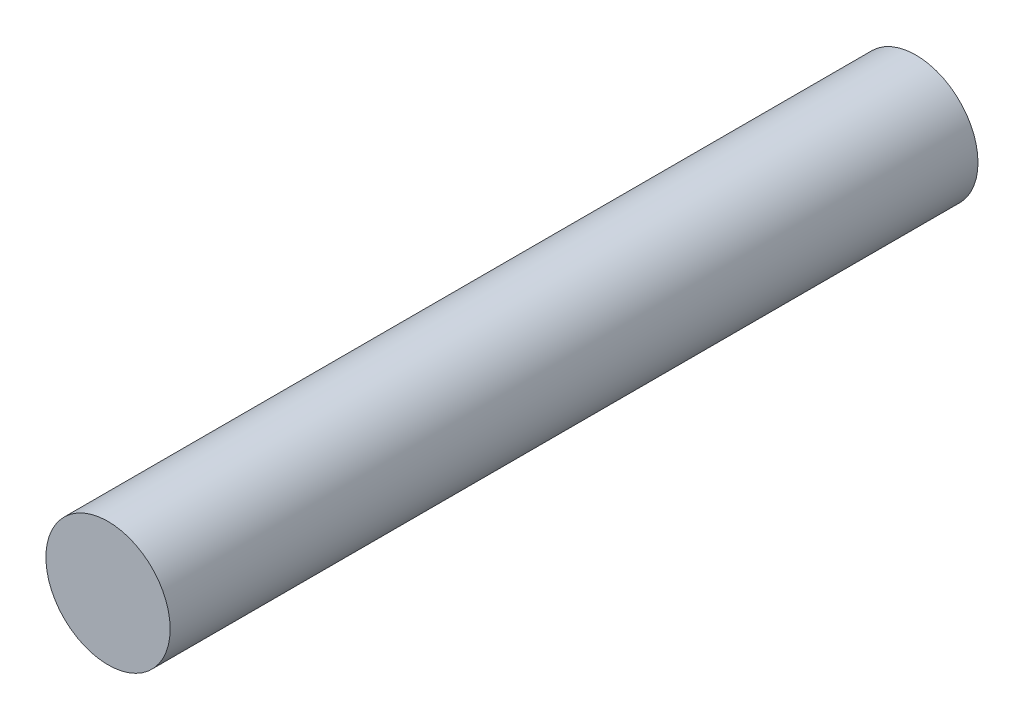
ISO-10303-21;
HEADER;
FILE_DESCRIPTION(('STEP AP214'),'2;1');
FILE_NAME('part.step','',(''),(''),'','','');
FILE_SCHEMA(('AUTOMOTIVE_DESIGN { 1 0 10303 214 1 1 1 1 }'));
ENDSEC;
DATA;
#1=APPLICATION_CONTEXT('core data for automotive mechanical design processes');
#2=APPLICATION_PROTOCOL_DEFINITION('international standard','automotive_design',2000,#1);
#3=PRODUCT_CONTEXT('',#1,'mechanical');
#4=PRODUCT('Part','Part','',(#3));
#5=PRODUCT_RELATED_PRODUCT_CATEGORY('part','',(#4));
#6=PRODUCT_DEFINITION_FORMATION('','',#4);
#7=PRODUCT_DEFINITION_CONTEXT('part definition',#1,'design');
#8=PRODUCT_DEFINITION('design','',#6,#7);
#9=PRODUCT_DEFINITION_SHAPE('','',#8);
#10=(LENGTH_UNIT() NAMED_UNIT(*) SI_UNIT(.MILLI.,.METRE.));
#11=(NAMED_UNIT(*) PLANE_ANGLE_UNIT() SI_UNIT($,.RADIAN.));
#12=(NAMED_UNIT(*) SI_UNIT($,.STERADIAN.) SOLID_ANGLE_UNIT());
#13=UNCERTAINTY_MEASURE_WITH_UNIT(LENGTH_MEASURE(1.E-05),#10,'distance_accuracy_value','');
#14=(GEOMETRIC_REPRESENTATION_CONTEXT(3) GLOBAL_UNCERTAINTY_ASSIGNED_CONTEXT((#13)) GLOBAL_UNIT_ASSIGNED_CONTEXT((#10,
#11,#12)) REPRESENTATION_CONTEXT('',''));
#15=CARTESIAN_POINT('',(0.,0.,0.));
#16=DIRECTION('',(0.,0.,1.));
#17=DIRECTION('',(1.,0.,0.));
#18=AXIS2_PLACEMENT_3D('',#15,#16,#17);
#19=CARTESIAN_POINT('',(0.,0.,41.275));
#20=DIRECTION('',(0.,0.,-1.));
#21=DIRECTION('',(-1.,0.,0.));
#22=AXIS2_PLACEMENT_3D('',#19,#20,#21);
#23=CYLINDRICAL_SURFACE('',#22,3.175);
#24=CARTESIAN_POINT('',(0.,0.,41.275));
#25=DIRECTION('',(0.,0.,1.));
#26=DIRECTION('',(1.,0.,0.));
#27=AXIS2_PLACEMENT_3D('',#24,#25,#26);
#28=CIRCLE('',#27,3.175);
#29=CARTESIAN_POINT('',(3.175,0.,41.275));
#30=VERTEX_POINT('',#29);
#31=EDGE_CURVE('E10',#30,#30,#28,.T.);
#32=ORIENTED_EDGE('',*,*,#31,.F.);
#33=EDGE_LOOP('',(#32));
#34=FACE_BOUND('',#33,.T.);
#35=CARTESIAN_POINT('',(0.,0.,0.));
#36=DIRECTION('',(0.,0.,1.));
#37=DIRECTION('',(1.,0.,0.));
#38=AXIS2_PLACEMENT_3D('',#35,#36,#37);
#39=CIRCLE('',#38,3.175);
#40=CARTESIAN_POINT('',(3.175,0.,0.));
#41=VERTEX_POINT('',#40);
#42=EDGE_CURVE('E34',#41,#41,#39,.T.);
#43=ORIENTED_EDGE('',*,*,#42,.T.);
#44=EDGE_LOOP('',(#43));
#45=FACE_BOUND('',#44,.T.);
#46=ADVANCED_FACE('F31',(#34,#45),#23,.T.);
#47=CARTESIAN_POINT('',(0.,0.,41.275));
#48=DIRECTION('',(0.,0.,1.));
#49=DIRECTION('',(1.,0.,0.));
#50=AXIS2_PLACEMENT_3D('',#47,#48,#49);
#51=PLANE('',#50);
#52=ORIENTED_EDGE('',*,*,#31,.T.);
#53=EDGE_LOOP('',(#52));
#54=FACE_BOUND('',#53,.T.);
#55=ADVANCED_FACE('F46',(#54),#51,.T.);
#56=CARTESIAN_POINT('',(0.,0.,0.));
#57=DIRECTION('',(0.,0.,1.));
#58=DIRECTION('',(1.,0.,0.));
#59=AXIS2_PLACEMENT_3D('',#56,#57,#58);
#60=PLANE('',#59);
#61=ORIENTED_EDGE('',*,*,#42,.F.);
#62=EDGE_LOOP('',(#61));
#63=FACE_BOUND('',#62,.T.);
#64=ADVANCED_FACE('F44',(#63),#60,.F.);
#65=CLOSED_SHELL('',(#46,#55,#64));
#66=MANIFOLD_SOLID_BREP('B2',#65);
#67=ADVANCED_BREP_SHAPE_REPRESENTATION('',(#18,#66),#14);
#68=SHAPE_DEFINITION_REPRESENTATION(#9,#67);
ENDSEC;
END-ISO-10303-21;
